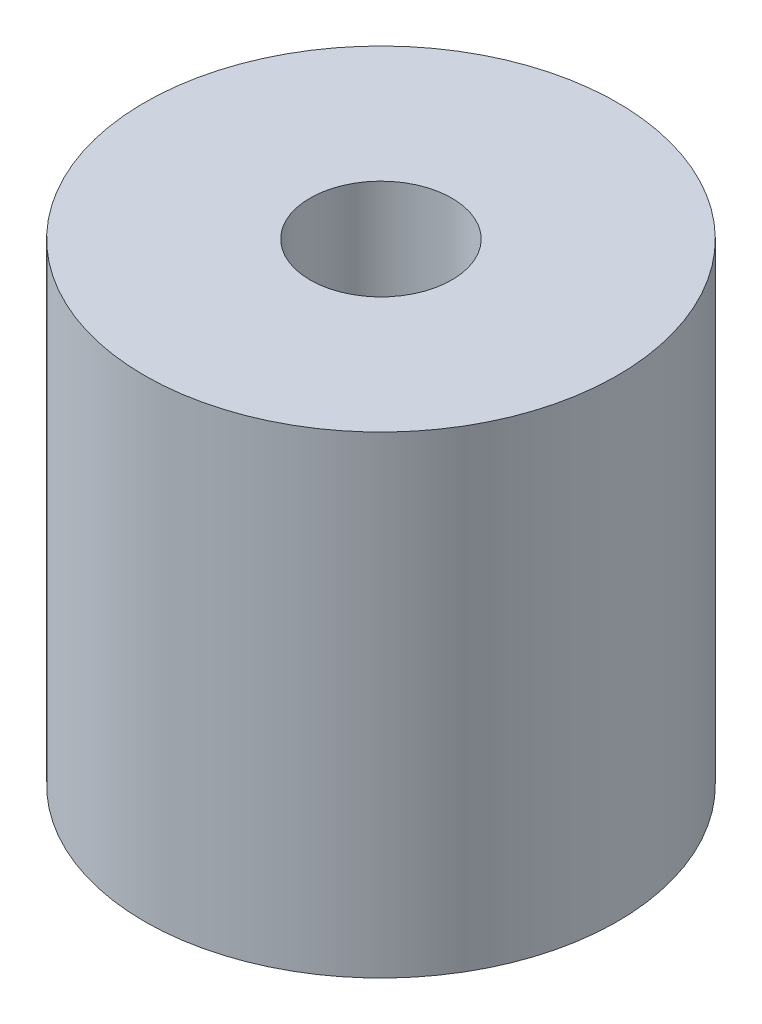
ISO-10303-21;
HEADER;
FILE_DESCRIPTION(('STEP AP214'),'2;1');
FILE_NAME('part.step','',(''),(''),'','','');
FILE_SCHEMA(('AUTOMOTIVE_DESIGN { 1 0 10303 214 1 1 1 1 }'));
ENDSEC;
DATA;
#1=APPLICATION_CONTEXT('core data for automotive mechanical design processes');
#2=APPLICATION_PROTOCOL_DEFINITION('international standard','automotive_design',2000,#1);
#3=PRODUCT_CONTEXT('',#1,'mechanical');
#4=PRODUCT('Part','Part','',(#3));
#5=PRODUCT_RELATED_PRODUCT_CATEGORY('part','',(#4));
#6=PRODUCT_DEFINITION_FORMATION('','',#4);
#7=PRODUCT_DEFINITION_CONTEXT('part definition',#1,'design');
#8=PRODUCT_DEFINITION('design','',#6,#7);
#9=PRODUCT_DEFINITION_SHAPE('','',#8);
#10=(LENGTH_UNIT() NAMED_UNIT(*) SI_UNIT(.MILLI.,.METRE.));
#11=(NAMED_UNIT(*) PLANE_ANGLE_UNIT() SI_UNIT($,.RADIAN.));
#12=(NAMED_UNIT(*) SI_UNIT($,.STERADIAN.) SOLID_ANGLE_UNIT());
#13=UNCERTAINTY_MEASURE_WITH_UNIT(LENGTH_MEASURE(1.E-05),#10,'distance_accuracy_value','');
#14=(GEOMETRIC_REPRESENTATION_CONTEXT(3) GLOBAL_UNCERTAINTY_ASSIGNED_CONTEXT((#13)) GLOBAL_UNIT_ASSIGNED_CONTEXT((#10,
#11,#12)) REPRESENTATION_CONTEXT('',''));
#15=CARTESIAN_POINT('',(0.,0.,0.));
#16=DIRECTION('',(0.,0.,1.));
#17=DIRECTION('',(1.,0.,0.));
#18=AXIS2_PLACEMENT_3D('',#15,#16,#17);
#19=CARTESIAN_POINT('',(0.,5.,0.));
#20=DIRECTION('',(0.,-1.,0.));
#21=DIRECTION('',(0.,0.,-1.));
#22=AXIS2_PLACEMENT_3D('',#19,#20,#21);
#23=CYLINDRICAL_SURFACE('',#22,2.5);
#24=CARTESIAN_POINT('',(0.,5.,0.));
#25=DIRECTION('',(0.,1.,0.));
#26=DIRECTION('',(0.,0.,1.));
#27=AXIS2_PLACEMENT_3D('',#24,#25,#26);
#28=CIRCLE('',#27,2.5);
#29=CARTESIAN_POINT('',(0.,5.,2.5));
#30=VERTEX_POINT('',#29);
#31=EDGE_CURVE('E10',#30,#30,#28,.T.);
#32=ORIENTED_EDGE('',*,*,#31,.F.);
#33=EDGE_LOOP('',(#32));
#34=FACE_BOUND('',#33,.T.);
#35=CARTESIAN_POINT('',(0.,0.,0.));
#36=DIRECTION('',(0.,1.,0.));
#37=DIRECTION('',(0.,0.,1.));
#38=AXIS2_PLACEMENT_3D('',#35,#36,#37);
#39=CIRCLE('',#38,2.5);
#40=CARTESIAN_POINT('',(0.,0.,2.5));
#41=VERTEX_POINT('',#40);
#42=EDGE_CURVE('E40',#41,#41,#39,.T.);
#43=ORIENTED_EDGE('',*,*,#42,.T.);
#44=EDGE_LOOP('',(#43));
#45=FACE_BOUND('',#44,.T.);
#46=ADVANCED_FACE('F37',(#34,#45),#23,.T.);
#47=CARTESIAN_POINT('',(0.,5.,0.));
#48=DIRECTION('',(0.,1.,0.));
#49=DIRECTION('',(0.,0.,1.));
#50=AXIS2_PLACEMENT_3D('',#47,#48,#49);
#51=PLANE('',#50);
#52=CARTESIAN_POINT('',(0.,5.,0.));
#53=DIRECTION('',(0.,1.,0.));
#54=DIRECTION('',(0.,0.,1.));
#55=AXIS2_PLACEMENT_3D('',#52,#53,#54);
#56=CIRCLE('',#55,0.75);
#57=CARTESIAN_POINT('',(0.,5.,0.75));
#58=VERTEX_POINT('',#57);
#59=EDGE_CURVE('E49',#58,#58,#56,.T.);
#60=ORIENTED_EDGE('',*,*,#59,.F.);
#61=EDGE_LOOP('',(#60));
#62=FACE_BOUND('',#61,.T.);
#63=ORIENTED_EDGE('',*,*,#31,.T.);
#64=EDGE_LOOP('',(#63));
#65=FACE_BOUND('',#64,.T.);
#66=ADVANCED_FACE('F64',(#62,#65),#51,.T.);
#67=CARTESIAN_POINT('',(0.,0.,0.));
#68=DIRECTION('',(0.,1.,0.));
#69=DIRECTION('',(0.,0.,1.));
#70=AXIS2_PLACEMENT_3D('',#67,#68,#69);
#71=PLANE('',#70);
#72=CARTESIAN_POINT('',(0.,0.,0.));
#73=DIRECTION('',(0.,1.,0.));
#74=DIRECTION('',(0.,0.,1.));
#75=AXIS2_PLACEMENT_3D('',#72,#73,#74);
#76=CIRCLE('',#75,0.75);
#77=CARTESIAN_POINT('',(0.,0.,0.75));
#78=VERTEX_POINT('',#77);
#79=EDGE_CURVE('E47',#78,#78,#76,.T.);
#80=ORIENTED_EDGE('',*,*,#79,.T.);
#81=EDGE_LOOP('',(#80));
#82=FACE_BOUND('',#81,.T.);
#83=ORIENTED_EDGE('',*,*,#42,.F.);
#84=EDGE_LOOP('',(#83));
#85=FACE_BOUND('',#84,.T.);
#86=ADVANCED_FACE('F55',(#82,#85),#71,.F.);
#87=CARTESIAN_POINT('',(0.,0.,0.));
#88=DIRECTION('',(0.,1.,0.));
#89=DIRECTION('',(0.,0.,1.));
#90=AXIS2_PLACEMENT_3D('',#87,#88,#89);
#91=CYLINDRICAL_SURFACE('',#90,0.75);
#92=ORIENTED_EDGE('',*,*,#79,.F.);
#93=EDGE_LOOP('',(#92));
#94=FACE_BOUND('',#93,.T.);
#95=ORIENTED_EDGE('',*,*,#59,.T.);
#96=EDGE_LOOP('',(#95));
#97=FACE_BOUND('',#96,.T.);
#98=ADVANCED_FACE('F58',(#94,#97),#91,.F.);
#99=CLOSED_SHELL('',(#46,#66,#86,#98));
#100=MANIFOLD_SOLID_BREP('B2',#99);
#101=ADVANCED_BREP_SHAPE_REPRESENTATION('',(#18,#100),#14);
#102=SHAPE_DEFINITION_REPRESENTATION(#9,#101);
ENDSEC;
END-ISO-10303-21;
